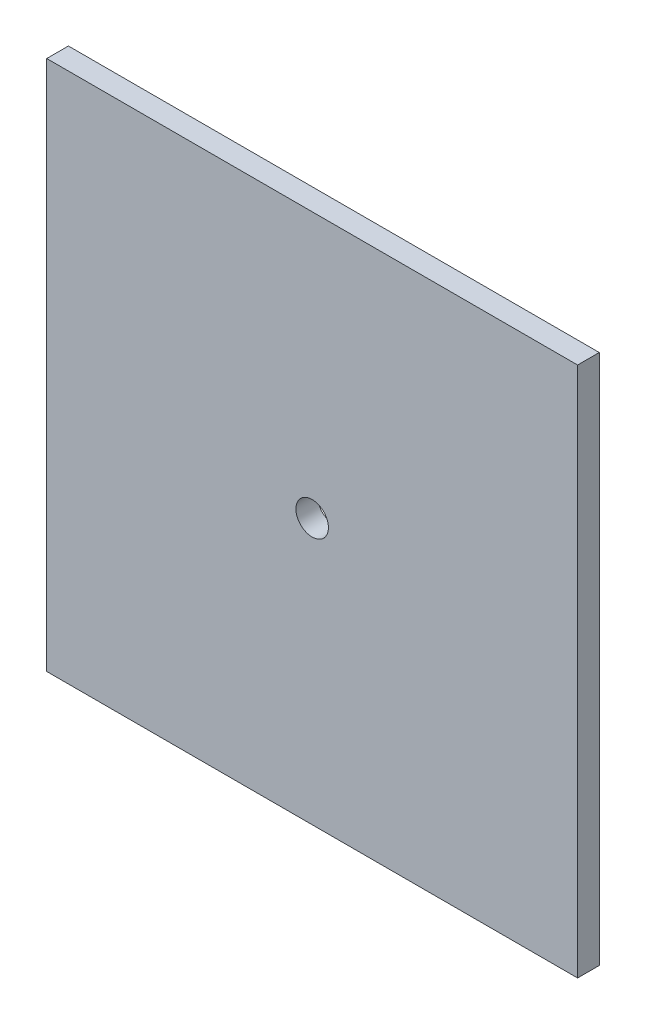
ISO-10303-21;
HEADER;
FILE_DESCRIPTION(('STEP AP214'),'2;1');
FILE_NAME('part.step','',(''),(''),'','','');
FILE_SCHEMA(('AUTOMOTIVE_DESIGN { 1 0 10303 214 1 1 1 1 }'));
ENDSEC;
DATA;
#1=APPLICATION_CONTEXT('core data for automotive mechanical design processes');
#2=APPLICATION_PROTOCOL_DEFINITION('international standard','automotive_design',2000,#1);
#3=PRODUCT_CONTEXT('',#1,'mechanical');
#4=PRODUCT('Part','Part','',(#3));
#5=PRODUCT_RELATED_PRODUCT_CATEGORY('part','',(#4));
#6=PRODUCT_DEFINITION_FORMATION('','',#4);
#7=PRODUCT_DEFINITION_CONTEXT('part definition',#1,'design');
#8=PRODUCT_DEFINITION('design','',#6,#7);
#9=PRODUCT_DEFINITION_SHAPE('','',#8);
#10=(LENGTH_UNIT() NAMED_UNIT(*) SI_UNIT(.MILLI.,.METRE.));
#11=(NAMED_UNIT(*) PLANE_ANGLE_UNIT() SI_UNIT($,.RADIAN.));
#12=(NAMED_UNIT(*) SI_UNIT($,.STERADIAN.) SOLID_ANGLE_UNIT());
#13=UNCERTAINTY_MEASURE_WITH_UNIT(LENGTH_MEASURE(1.E-05),#10,'distance_accuracy_value','');
#14=(GEOMETRIC_REPRESENTATION_CONTEXT(3) GLOBAL_UNCERTAINTY_ASSIGNED_CONTEXT((#13)) GLOBAL_UNIT_ASSIGNED_CONTEXT((#10,
#11,#12)) REPRESENTATION_CONTEXT('',''));
#15=CARTESIAN_POINT('',(0.,0.,0.));
#16=DIRECTION('',(0.,0.,1.));
#17=DIRECTION('',(1.,0.,0.));
#18=AXIS2_PLACEMENT_3D('',#15,#16,#17);
#19=CARTESIAN_POINT('',(0.,0.,2.));
#20=DIRECTION('',(0.,0.,1.));
#21=DIRECTION('',(1.,0.,0.));
#22=AXIS2_PLACEMENT_3D('',#19,#20,#21);
#23=PLANE('',#22);
#24=DIRECTION('',(0.,1.,0.));
#25=VECTOR('',#24,1.);
#26=CARTESIAN_POINT('',(24.5,24.5,2.));
#27=LINE('',#26,#25);
#28=CARTESIAN_POINT('',(24.5,-24.5,2.));
#29=VERTEX_POINT('',#28);
#30=CARTESIAN_POINT('',(24.5,24.5,2.));
#31=VERTEX_POINT('',#30);
#32=EDGE_CURVE('E85',#29,#31,#27,.T.);
#33=ORIENTED_EDGE('',*,*,#32,.T.);
#34=DIRECTION('',(-1.,0.,0.));
#35=VECTOR('',#34,1.);
#36=CARTESIAN_POINT('',(-24.5,24.5,2.));
#37=LINE('',#36,#35);
#38=CARTESIAN_POINT('',(-24.5,24.5,2.));
#39=VERTEX_POINT('',#38);
#40=EDGE_CURVE('E80',#31,#39,#37,.T.);
#41=ORIENTED_EDGE('',*,*,#40,.T.);
#42=DIRECTION('',(0.,-1.,0.));
#43=VECTOR('',#42,1.);
#44=CARTESIAN_POINT('',(-24.5,24.5,2.));
#45=LINE('',#44,#43);
#46=CARTESIAN_POINT('',(-24.5,-24.5,2.));
#47=VERTEX_POINT('',#46);
#48=EDGE_CURVE('E83',#39,#47,#45,.T.);
#49=ORIENTED_EDGE('',*,*,#48,.T.);
#50=DIRECTION('',(1.,0.,0.));
#51=VECTOR('',#50,1.);
#52=CARTESIAN_POINT('',(-24.5,-24.5,2.));
#53=LINE('',#52,#51);
#54=EDGE_CURVE('E50',#47,#29,#53,.T.);
#55=ORIENTED_EDGE('',*,*,#54,.T.);
#56=EDGE_LOOP('',(#33,#41,#49,#55));
#57=FACE_BOUND('',#56,.T.);
#58=CARTESIAN_POINT('',(0.,0.,2.));
#59=DIRECTION('',(0.,0.,1.));
#60=DIRECTION('',(1.,0.,0.));
#61=AXIS2_PLACEMENT_3D('',#58,#59,#60);
#62=CIRCLE('',#61,1.5);
#63=CARTESIAN_POINT('',(1.49999999999998,0.,2.));
#64=VERTEX_POINT('',#63);
#65=EDGE_CURVE('E100',#64,#64,#62,.T.);
#66=ORIENTED_EDGE('',*,*,#65,.F.);
#67=EDGE_LOOP('',(#66));
#68=FACE_BOUND('',#67,.T.);
#69=ADVANCED_FACE('F33',(#57,#68),#23,.T.);
#70=CARTESIAN_POINT('',(0.,0.,0.));
#71=DIRECTION('',(0.,0.,1.));
#72=DIRECTION('',(1.,0.,0.));
#73=AXIS2_PLACEMENT_3D('',#70,#71,#72);
#74=PLANE('',#73);
#75=DIRECTION('',(0.,1.,0.));
#76=VECTOR('',#75,1.);
#77=CARTESIAN_POINT('',(24.5,24.5,0.));
#78=LINE('',#77,#76);
#79=CARTESIAN_POINT('',(24.5,-24.5,0.));
#80=VERTEX_POINT('',#79);
#81=CARTESIAN_POINT('',(24.5,24.5,0.));
#82=VERTEX_POINT('',#81);
#83=EDGE_CURVE('E97',#80,#82,#78,.T.);
#84=ORIENTED_EDGE('',*,*,#83,.F.);
#85=DIRECTION('',(1.,0.,0.));
#86=VECTOR('',#85,1.);
#87=CARTESIAN_POINT('',(-24.5,-24.5,0.));
#88=LINE('',#87,#86);
#89=CARTESIAN_POINT('',(-24.5,-24.5,0.));
#90=VERTEX_POINT('',#89);
#91=EDGE_CURVE('E73',#90,#80,#88,.T.);
#92=ORIENTED_EDGE('',*,*,#91,.F.);
#93=DIRECTION('',(0.,-1.,0.));
#94=VECTOR('',#93,1.);
#95=CARTESIAN_POINT('',(-24.5,24.5,0.));
#96=LINE('',#95,#94);
#97=CARTESIAN_POINT('',(-24.5,24.5,0.));
#98=VERTEX_POINT('',#97);
#99=EDGE_CURVE('E67',#98,#90,#96,.T.);
#100=ORIENTED_EDGE('',*,*,#99,.F.);
#101=DIRECTION('',(-1.,0.,0.));
#102=VECTOR('',#101,1.);
#103=CARTESIAN_POINT('',(-24.5,24.5,0.));
#104=LINE('',#103,#102);
#105=EDGE_CURVE('E89',#82,#98,#104,.T.);
#106=ORIENTED_EDGE('',*,*,#105,.F.);
#107=EDGE_LOOP('',(#84,#92,#100,#106));
#108=FACE_BOUND('',#107,.T.);
#109=CARTESIAN_POINT('',(0.,0.,0.));
#110=DIRECTION('',(0.,0.,1.));
#111=DIRECTION('',(1.,0.,0.));
#112=AXIS2_PLACEMENT_3D('',#109,#110,#111);
#113=CIRCLE('',#112,1.5);
#114=CARTESIAN_POINT('',(1.49999999999998,0.,0.));
#115=VERTEX_POINT('',#114);
#116=EDGE_CURVE('E112',#115,#115,#113,.T.);
#117=ORIENTED_EDGE('',*,*,#116,.T.);
#118=EDGE_LOOP('',(#117));
#119=FACE_BOUND('',#118,.T.);
#120=ADVANCED_FACE('F108',(#108,#119),#74,.F.);
#121=CARTESIAN_POINT('',(24.5,24.5,2.));
#122=DIRECTION('',(-1.,0.,0.));
#123=DIRECTION('',(0.,-1.,0.));
#124=AXIS2_PLACEMENT_3D('',#121,#122,#123);
#125=PLANE('',#124);
#126=ORIENTED_EDGE('',*,*,#83,.T.);
#127=DIRECTION('',(0.,0.,-1.));
#128=VECTOR('',#127,1.);
#129=CARTESIAN_POINT('',(24.5,24.5,2.));
#130=LINE('',#129,#128);
#131=EDGE_CURVE('E11',#31,#82,#130,.T.);
#132=ORIENTED_EDGE('',*,*,#131,.F.);
#133=ORIENTED_EDGE('',*,*,#32,.F.);
#134=DIRECTION('',(0.,0.,-1.));
#135=VECTOR('',#134,1.);
#136=CARTESIAN_POINT('',(24.5,-24.5,2.));
#137=LINE('',#136,#135);
#138=EDGE_CURVE('E93',#29,#80,#137,.T.);
#139=ORIENTED_EDGE('',*,*,#138,.T.);
#140=EDGE_LOOP('',(#126,#132,#133,#139));
#141=FACE_BOUND('',#140,.T.);
#142=ADVANCED_FACE('F35',(#141),#125,.F.);
#143=CARTESIAN_POINT('',(-24.5,24.5,2.));
#144=DIRECTION('',(0.,-1.,0.));
#145=DIRECTION('',(1.,0.,0.));
#146=AXIS2_PLACEMENT_3D('',#143,#144,#145);
#147=PLANE('',#146);
#148=ORIENTED_EDGE('',*,*,#105,.T.);
#149=DIRECTION('',(0.,0.,-1.));
#150=VECTOR('',#149,1.);
#151=CARTESIAN_POINT('',(-24.5,24.5,2.));
#152=LINE('',#151,#150);
#153=EDGE_CURVE('E42',#39,#98,#152,.T.);
#154=ORIENTED_EDGE('',*,*,#153,.F.);
#155=ORIENTED_EDGE('',*,*,#40,.F.);
#156=ORIENTED_EDGE('',*,*,#131,.T.);
#157=EDGE_LOOP('',(#148,#154,#155,#156));
#158=FACE_BOUND('',#157,.T.);
#159=ADVANCED_FACE('F88',(#158),#147,.F.);
#160=CARTESIAN_POINT('',(-24.5,24.5,2.));
#161=DIRECTION('',(1.,0.,0.));
#162=DIRECTION('',(0.,0.,-1.));
#163=AXIS2_PLACEMENT_3D('',#160,#161,#162);
#164=PLANE('',#163);
#165=ORIENTED_EDGE('',*,*,#99,.T.);
#166=DIRECTION('',(0.,0.,-1.));
#167=VECTOR('',#166,1.);
#168=CARTESIAN_POINT('',(-24.5,-24.5,2.));
#169=LINE('',#168,#167);
#170=EDGE_CURVE('E90',#47,#90,#169,.T.);
#171=ORIENTED_EDGE('',*,*,#170,.F.);
#172=ORIENTED_EDGE('',*,*,#48,.F.);
#173=ORIENTED_EDGE('',*,*,#153,.T.);
#174=EDGE_LOOP('',(#165,#171,#172,#173));
#175=FACE_BOUND('',#174,.T.);
#176=ADVANCED_FACE('F91',(#175),#164,.F.);
#177=CARTESIAN_POINT('',(-24.5,-24.5,2.));
#178=DIRECTION('',(0.,1.,0.));
#179=DIRECTION('',(0.,0.,1.));
#180=AXIS2_PLACEMENT_3D('',#177,#178,#179);
#181=PLANE('',#180);
#182=ORIENTED_EDGE('',*,*,#91,.T.);
#183=ORIENTED_EDGE('',*,*,#138,.F.);
#184=ORIENTED_EDGE('',*,*,#54,.F.);
#185=ORIENTED_EDGE('',*,*,#170,.T.);
#186=EDGE_LOOP('',(#182,#183,#184,#185));
#187=FACE_BOUND('',#186,.T.);
#188=ADVANCED_FACE('F105',(#187),#181,.F.);
#189=CARTESIAN_POINT('',(0.,0.,2.));
#190=DIRECTION('',(0.,0.,-1.));
#191=DIRECTION('',(-1.,0.,0.));
#192=AXIS2_PLACEMENT_3D('',#189,#190,#191);
#193=CYLINDRICAL_SURFACE('',#192,1.5);
#194=ORIENTED_EDGE('',*,*,#65,.T.);
#195=EDGE_LOOP('',(#194));
#196=FACE_BOUND('',#195,.T.);
#197=ORIENTED_EDGE('',*,*,#116,.F.);
#198=EDGE_LOOP('',(#197));
#199=FACE_BOUND('',#198,.T.);
#200=ADVANCED_FACE('F118',(#196,#199),#193,.F.);
#201=CLOSED_SHELL('',(#69,#120,#142,#159,#176,#188,#200));
#202=MANIFOLD_SOLID_BREP('B2',#201);
#203=ADVANCED_BREP_SHAPE_REPRESENTATION('',(#18,#202),#14);
#204=SHAPE_DEFINITION_REPRESENTATION(#9,#203);
ENDSEC;
END-ISO-10303-21;
